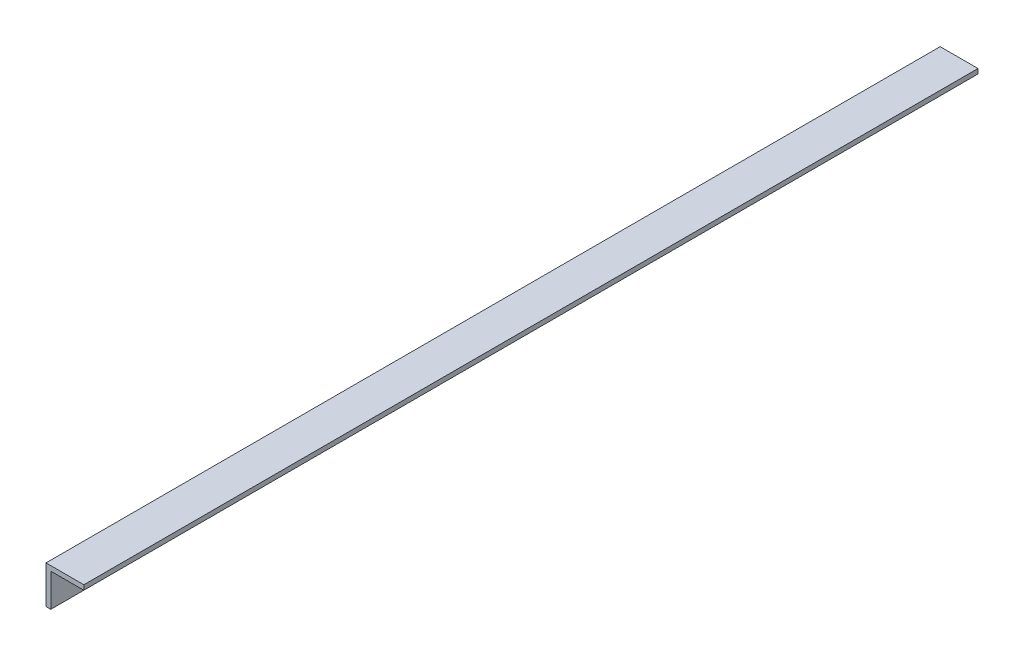
ISO-10303-21;
HEADER;
FILE_DESCRIPTION(('STEP AP214'),'2;1');
FILE_NAME('part.step','',(''),(''),'','','');
FILE_SCHEMA(('AUTOMOTIVE_DESIGN { 1 0 10303 214 1 1 1 1 }'));
ENDSEC;
DATA;
#1=APPLICATION_CONTEXT('core data for automotive mechanical design processes');
#2=APPLICATION_PROTOCOL_DEFINITION('international standard','automotive_design',2000,#1);
#3=PRODUCT_CONTEXT('',#1,'mechanical');
#4=PRODUCT('Part','Part','',(#3));
#5=PRODUCT_RELATED_PRODUCT_CATEGORY('part','',(#4));
#6=PRODUCT_DEFINITION_FORMATION('','',#4);
#7=PRODUCT_DEFINITION_CONTEXT('part definition',#1,'design');
#8=PRODUCT_DEFINITION('design','',#6,#7);
#9=PRODUCT_DEFINITION_SHAPE('','',#8);
#10=(LENGTH_UNIT() NAMED_UNIT(*) SI_UNIT(.MILLI.,.METRE.));
#11=(NAMED_UNIT(*) PLANE_ANGLE_UNIT() SI_UNIT($,.RADIAN.));
#12=(NAMED_UNIT(*) SI_UNIT($,.STERADIAN.) SOLID_ANGLE_UNIT());
#13=UNCERTAINTY_MEASURE_WITH_UNIT(LENGTH_MEASURE(1.E-05),#10,'distance_accuracy_value','');
#14=(GEOMETRIC_REPRESENTATION_CONTEXT(3) GLOBAL_UNCERTAINTY_ASSIGNED_CONTEXT((#13)) GLOBAL_UNIT_ASSIGNED_CONTEXT((#10,
#11,#12)) REPRESENTATION_CONTEXT('',''));
#15=CARTESIAN_POINT('',(0.,0.,0.));
#16=DIRECTION('',(0.,0.,1.));
#17=DIRECTION('',(1.,0.,0.));
#18=AXIS2_PLACEMENT_3D('',#15,#16,#17);
#19=CARTESIAN_POINT('',(-13.4470588235294,-1.41941176470588,300.));
#20=DIRECTION('',(1.,0.,0.));
#21=DIRECTION('',(0.,0.,-1.));
#22=AXIS2_PLACEMENT_3D('',#19,#20,#21);
#23=PLANE('',#22);
#24=DIRECTION('',(0.,-1.,0.));
#25=VECTOR('',#24,1.);
#26=CARTESIAN_POINT('',(-13.4470588235294,-1.41941176470588,0.));
#27=LINE('',#26,#25);
#28=CARTESIAN_POINT('',(-13.4470588235294,11.2805882352941,0.));
#29=VERTEX_POINT('',#28);
#30=CARTESIAN_POINT('',(-13.4470588235294,-1.41941176470588,0.));
#31=VERTEX_POINT('',#30);
#32=EDGE_CURVE('E126',#29,#31,#27,.T.);
#33=ORIENTED_EDGE('',*,*,#32,.T.);
#34=DIRECTION('',(0.,0.,-1.));
#35=VECTOR('',#34,1.);
#36=CARTESIAN_POINT('',(-13.4470588235294,-1.41941176470588,300.));
#37=LINE('',#36,#35);
#38=CARTESIAN_POINT('',(-13.4470588235294,-1.41941176470588,300.));
#39=VERTEX_POINT('',#38);
#40=EDGE_CURVE('E11',#39,#31,#37,.T.);
#41=ORIENTED_EDGE('',*,*,#40,.F.);
#42=DIRECTION('',(0.,-1.,0.));
#43=VECTOR('',#42,1.);
#44=CARTESIAN_POINT('',(-13.4470588235294,-1.41941176470588,300.));
#45=LINE('',#44,#43);
#46=CARTESIAN_POINT('',(-13.4470588235294,11.2805882352941,300.));
#47=VERTEX_POINT('',#46);
#48=EDGE_CURVE('E136',#47,#39,#45,.T.);
#49=ORIENTED_EDGE('',*,*,#48,.F.);
#50=DIRECTION('',(0.,0.,-1.));
#51=VECTOR('',#50,1.);
#52=CARTESIAN_POINT('',(-13.4470588235294,11.2805882352941,300.));
#53=LINE('',#52,#51);
#54=EDGE_CURVE('E122',#47,#29,#53,.T.);
#55=ORIENTED_EDGE('',*,*,#54,.T.);
#56=EDGE_LOOP('',(#33,#41,#49,#55));
#57=FACE_BOUND('',#56,.T.);
#58=ADVANCED_FACE('F42',(#57),#23,.F.);
#59=CARTESIAN_POINT('',(-11.8470588235294,-1.41941176470588,300.));
#60=DIRECTION('',(0.,1.,0.));
#61=DIRECTION('',(-1.,0.,0.));
#62=AXIS2_PLACEMENT_3D('',#59,#60,#61);
#63=PLANE('',#62);
#64=DIRECTION('',(1.,0.,0.));
#65=VECTOR('',#64,1.);
#66=CARTESIAN_POINT('',(-11.8470588235294,-1.41941176470588,0.));
#67=LINE('',#66,#65);
#68=CARTESIAN_POINT('',(-11.8470588235294,-1.41941176470588,0.));
#69=VERTEX_POINT('',#68);
#70=EDGE_CURVE('E129',#31,#69,#67,.T.);
#71=ORIENTED_EDGE('',*,*,#70,.T.);
#72=DIRECTION('',(0.,0.,-1.));
#73=VECTOR('',#72,1.);
#74=CARTESIAN_POINT('',(-11.8470588235294,-1.41941176470588,300.));
#75=LINE('',#74,#73);
#76=CARTESIAN_POINT('',(-11.8470588235294,-1.41941176470588,300.));
#77=VERTEX_POINT('',#76);
#78=EDGE_CURVE('E50',#77,#69,#75,.T.);
#79=ORIENTED_EDGE('',*,*,#78,.F.);
#80=DIRECTION('',(1.,0.,0.));
#81=VECTOR('',#80,1.);
#82=CARTESIAN_POINT('',(-11.8470588235294,-1.41941176470588,300.));
#83=LINE('',#82,#81);
#84=EDGE_CURVE('E95',#39,#77,#83,.T.);
#85=ORIENTED_EDGE('',*,*,#84,.F.);
#86=ORIENTED_EDGE('',*,*,#40,.T.);
#87=EDGE_LOOP('',(#71,#79,#85,#86));
#88=FACE_BOUND('',#87,.T.);
#89=ADVANCED_FACE('F160',(#88),#63,.F.);
#90=CARTESIAN_POINT('',(-11.8470588235294,9.68058823529412,300.));
#91=DIRECTION('',(-1.,0.,0.));
#92=DIRECTION('',(0.,-1.,0.));
#93=AXIS2_PLACEMENT_3D('',#90,#91,#92);
#94=PLANE('',#93);
#95=DIRECTION('',(0.,1.,0.));
#96=VECTOR('',#95,1.);
#97=CARTESIAN_POINT('',(-11.8470588235294,9.68058823529412,0.));
#98=LINE('',#97,#96);
#99=CARTESIAN_POINT('',(-11.8470588235294,9.68058823529412,0.));
#100=VERTEX_POINT('',#99);
#101=EDGE_CURVE('E131',#69,#100,#98,.T.);
#102=ORIENTED_EDGE('',*,*,#101,.T.);
#103=DIRECTION('',(0.,0.,-1.));
#104=VECTOR('',#103,1.);
#105=CARTESIAN_POINT('',(-11.8470588235294,9.68058823529412,300.));
#106=LINE('',#105,#104);
#107=CARTESIAN_POINT('',(-11.8470588235294,9.68058823529412,300.));
#108=VERTEX_POINT('',#107);
#109=EDGE_CURVE('E117',#108,#100,#106,.T.);
#110=ORIENTED_EDGE('',*,*,#109,.F.);
#111=DIRECTION('',(0.,1.,0.));
#112=VECTOR('',#111,1.);
#113=CARTESIAN_POINT('',(-11.8470588235294,9.68058823529412,300.));
#114=LINE('',#113,#112);
#115=EDGE_CURVE('E108',#77,#108,#114,.T.);
#116=ORIENTED_EDGE('',*,*,#115,.F.);
#117=ORIENTED_EDGE('',*,*,#78,.T.);
#118=EDGE_LOOP('',(#102,#110,#116,#117));
#119=FACE_BOUND('',#118,.T.);
#120=ADVANCED_FACE('F142',(#119),#94,.F.);
#121=CARTESIAN_POINT('',(-0.747058823529415,9.68058823529412,300.));
#122=DIRECTION('',(0.,1.,0.));
#123=DIRECTION('',(-1.,0.,0.));
#124=AXIS2_PLACEMENT_3D('',#121,#122,#123);
#125=PLANE('',#124);
#126=DIRECTION('',(1.,0.,0.));
#127=VECTOR('',#126,1.);
#128=CARTESIAN_POINT('',(-0.747058823529415,9.68058823529412,0.));
#129=LINE('',#128,#127);
#130=CARTESIAN_POINT('',(-0.747058823529415,9.68058823529412,0.));
#131=VERTEX_POINT('',#130);
#132=EDGE_CURVE('E116',#100,#131,#129,.T.);
#133=ORIENTED_EDGE('',*,*,#132,.T.);
#134=DIRECTION('',(0.,0.,-1.));
#135=VECTOR('',#134,1.);
#136=CARTESIAN_POINT('',(-0.747058823529415,9.68058823529412,300.));
#137=LINE('',#136,#135);
#138=CARTESIAN_POINT('',(-0.747058823529415,9.68058823529412,300.));
#139=VERTEX_POINT('',#138);
#140=EDGE_CURVE('E113',#139,#131,#137,.T.);
#141=ORIENTED_EDGE('',*,*,#140,.F.);
#142=DIRECTION('',(1.,0.,0.));
#143=VECTOR('',#142,1.);
#144=CARTESIAN_POINT('',(-0.747058823529415,9.68058823529412,300.));
#145=LINE('',#144,#143);
#146=EDGE_CURVE('E102',#108,#139,#145,.T.);
#147=ORIENTED_EDGE('',*,*,#146,.F.);
#148=ORIENTED_EDGE('',*,*,#109,.T.);
#149=EDGE_LOOP('',(#133,#141,#147,#148));
#150=FACE_BOUND('',#149,.T.);
#151=ADVANCED_FACE('F114',(#150),#125,.F.);
#152=CARTESIAN_POINT('',(-0.747058823529415,11.2805882352941,300.));
#153=DIRECTION('',(-1.,0.,0.));
#154=DIRECTION('',(0.,-1.,0.));
#155=AXIS2_PLACEMENT_3D('',#152,#153,#154);
#156=PLANE('',#155);
#157=DIRECTION('',(0.,1.,0.));
#158=VECTOR('',#157,1.);
#159=CARTESIAN_POINT('',(-0.747058823529415,11.2805882352941,0.));
#160=LINE('',#159,#158);
#161=CARTESIAN_POINT('',(-0.747058823529415,11.2805882352941,0.));
#162=VERTEX_POINT('',#161);
#163=EDGE_CURVE('E81',#131,#162,#160,.T.);
#164=ORIENTED_EDGE('',*,*,#163,.T.);
#165=DIRECTION('',(0.,0.,-1.));
#166=VECTOR('',#165,1.);
#167=CARTESIAN_POINT('',(-0.747058823529415,11.2805882352941,300.));
#168=LINE('',#167,#166);
#169=CARTESIAN_POINT('',(-0.747058823529415,11.2805882352941,300.));
#170=VERTEX_POINT('',#169);
#171=EDGE_CURVE('E118',#170,#162,#168,.T.);
#172=ORIENTED_EDGE('',*,*,#171,.F.);
#173=DIRECTION('',(0.,1.,0.));
#174=VECTOR('',#173,1.);
#175=CARTESIAN_POINT('',(-0.747058823529415,11.2805882352941,300.));
#176=LINE('',#175,#174);
#177=EDGE_CURVE('E106',#139,#170,#176,.T.);
#178=ORIENTED_EDGE('',*,*,#177,.F.);
#179=ORIENTED_EDGE('',*,*,#140,.T.);
#180=EDGE_LOOP('',(#164,#172,#178,#179));
#181=FACE_BOUND('',#180,.T.);
#182=ADVANCED_FACE('F120',(#181),#156,.F.);
#183=CARTESIAN_POINT('',(-13.4470588235294,11.2805882352941,300.));
#184=DIRECTION('',(0.,-1.,0.));
#185=DIRECTION('',(0.,0.,-1.));
#186=AXIS2_PLACEMENT_3D('',#183,#184,#185);
#187=PLANE('',#186);
#188=DIRECTION('',(-1.,0.,0.));
#189=VECTOR('',#188,1.);
#190=CARTESIAN_POINT('',(-13.4470588235294,11.2805882352941,0.));
#191=LINE('',#190,#189);
#192=EDGE_CURVE('E87',#162,#29,#191,.T.);
#193=ORIENTED_EDGE('',*,*,#192,.T.);
#194=ORIENTED_EDGE('',*,*,#54,.F.);
#195=DIRECTION('',(-1.,0.,0.));
#196=VECTOR('',#195,1.);
#197=CARTESIAN_POINT('',(-13.4470588235294,11.2805882352941,300.));
#198=LINE('',#197,#196);
#199=EDGE_CURVE('E58',#170,#47,#198,.T.);
#200=ORIENTED_EDGE('',*,*,#199,.F.);
#201=ORIENTED_EDGE('',*,*,#171,.T.);
#202=EDGE_LOOP('',(#193,#194,#200,#201));
#203=FACE_BOUND('',#202,.T.);
#204=ADVANCED_FACE('F149',(#203),#187,.F.);
#205=CARTESIAN_POINT('',(0.,0.,300.));
#206=DIRECTION('',(0.,0.,-1.));
#207=DIRECTION('',(-1.,0.,0.));
#208=AXIS2_PLACEMENT_3D('',#205,#206,#207);
#209=PLANE('',#208);
#210=ORIENTED_EDGE('',*,*,#48,.T.);
#211=ORIENTED_EDGE('',*,*,#84,.T.);
#212=ORIENTED_EDGE('',*,*,#115,.T.);
#213=ORIENTED_EDGE('',*,*,#146,.T.);
#214=ORIENTED_EDGE('',*,*,#177,.T.);
#215=ORIENTED_EDGE('',*,*,#199,.T.);
#216=EDGE_LOOP('',(#210,#211,#212,#213,#214,#215));
#217=FACE_BOUND('',#216,.T.);
#218=ADVANCED_FACE('F104',(#217),#209,.F.);
#219=CARTESIAN_POINT('',(0.,0.,0.));
#220=DIRECTION('',(0.,0.,-1.));
#221=DIRECTION('',(-1.,0.,0.));
#222=AXIS2_PLACEMENT_3D('',#219,#220,#221);
#223=PLANE('',#222);
#224=ORIENTED_EDGE('',*,*,#32,.F.);
#225=ORIENTED_EDGE('',*,*,#192,.F.);
#226=ORIENTED_EDGE('',*,*,#163,.F.);
#227=ORIENTED_EDGE('',*,*,#132,.F.);
#228=ORIENTED_EDGE('',*,*,#101,.F.);
#229=ORIENTED_EDGE('',*,*,#70,.F.);
#230=EDGE_LOOP('',(#224,#225,#226,#227,#228,#229));
#231=FACE_BOUND('',#230,.T.);
#232=ADVANCED_FACE('F145',(#231),#223,.T.);
#233=CLOSED_SHELL('',(#58,#89,#120,#151,#182,#204,#218,#232));
#234=MANIFOLD_SOLID_BREP('B2',#233);
#235=ADVANCED_BREP_SHAPE_REPRESENTATION('',(#18,#234),#14);
#236=SHAPE_DEFINITION_REPRESENTATION(#9,#235);
ENDSEC;
END-ISO-10303-21;
